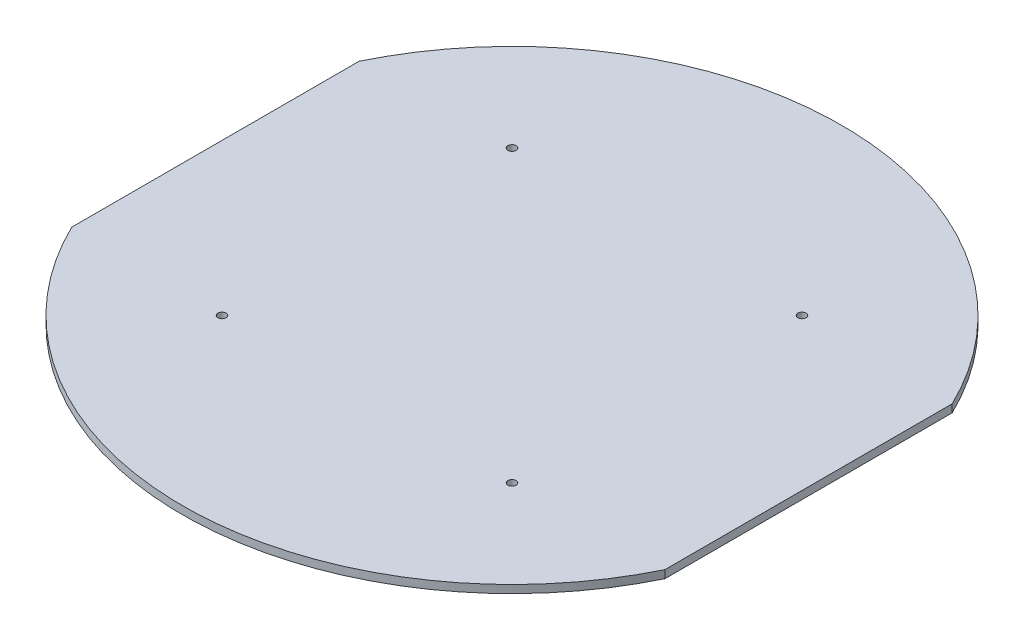
ISO-10303-21;
HEADER;
FILE_DESCRIPTION(('STEP AP214'),'2;1');
FILE_NAME('part.step','',(''),(''),'','','');
FILE_SCHEMA(('AUTOMOTIVE_DESIGN { 1 0 10303 214 1 1 1 1 }'));
ENDSEC;
DATA;
#1=APPLICATION_CONTEXT('core data for automotive mechanical design processes');
#2=APPLICATION_PROTOCOL_DEFINITION('international standard','automotive_design',2000,#1);
#3=PRODUCT_CONTEXT('',#1,'mechanical');
#4=PRODUCT('Part','Part','',(#3));
#5=PRODUCT_RELATED_PRODUCT_CATEGORY('part','',(#4));
#6=PRODUCT_DEFINITION_FORMATION('','',#4);
#7=PRODUCT_DEFINITION_CONTEXT('part definition',#1,'design');
#8=PRODUCT_DEFINITION('design','',#6,#7);
#9=PRODUCT_DEFINITION_SHAPE('','',#8);
#10=(LENGTH_UNIT() NAMED_UNIT(*) SI_UNIT(.MILLI.,.METRE.));
#11=(NAMED_UNIT(*) PLANE_ANGLE_UNIT() SI_UNIT($,.RADIAN.));
#12=(NAMED_UNIT(*) SI_UNIT($,.STERADIAN.) SOLID_ANGLE_UNIT());
#13=UNCERTAINTY_MEASURE_WITH_UNIT(LENGTH_MEASURE(1.E-05),#10,'distance_accuracy_value','');
#14=(GEOMETRIC_REPRESENTATION_CONTEXT(3) GLOBAL_UNCERTAINTY_ASSIGNED_CONTEXT((#13)) GLOBAL_UNIT_ASSIGNED_CONTEXT((#10,
#11,#12)) REPRESENTATION_CONTEXT('',''));
#15=CARTESIAN_POINT('',(0.,0.,0.));
#16=DIRECTION('',(0.,0.,1.));
#17=DIRECTION('',(1.,0.,0.));
#18=AXIS2_PLACEMENT_3D('',#15,#16,#17);
#19=CARTESIAN_POINT('',(112.5,3.,0.));
#20=DIRECTION('',(1.,0.,0.));
#21=DIRECTION('',(0.,0.,-1.));
#22=AXIS2_PLACEMENT_3D('',#19,#20,#21);
#23=PLANE('',#22);
#24=DIRECTION('',(0.,0.,1.));
#25=VECTOR('',#24,1.);
#26=CARTESIAN_POINT('',(112.5,0.,0.));
#27=LINE('',#26,#25);
#28=CARTESIAN_POINT('',(112.5,0.,-54.4862367942585));
#29=VERTEX_POINT('',#28);
#30=CARTESIAN_POINT('',(112.5,0.,54.4862367942585));
#31=VERTEX_POINT('',#30);
#32=EDGE_CURVE('E118',#29,#31,#27,.T.);
#33=ORIENTED_EDGE('',*,*,#32,.F.);
#34=DIRECTION('',(0.,-1.,0.));
#35=VECTOR('',#34,1.);
#36=CARTESIAN_POINT('',(112.5,3.,-54.4862367942585));
#37=LINE('',#36,#35);
#38=CARTESIAN_POINT('',(112.5,3.,-54.4862367942585));
#39=VERTEX_POINT('',#38);
#40=EDGE_CURVE('E11',#39,#29,#37,.T.);
#41=ORIENTED_EDGE('',*,*,#40,.F.);
#42=DIRECTION('',(0.,0.,1.));
#43=VECTOR('',#42,1.);
#44=CARTESIAN_POINT('',(112.5,3.,0.));
#45=LINE('',#44,#43);
#46=CARTESIAN_POINT('',(112.5,3.,54.4862367942585));
#47=VERTEX_POINT('',#46);
#48=EDGE_CURVE('E100',#39,#47,#45,.T.);
#49=ORIENTED_EDGE('',*,*,#48,.T.);
#50=DIRECTION('',(0.,-1.,0.));
#51=VECTOR('',#50,1.);
#52=CARTESIAN_POINT('',(112.5,3.,54.4862367942585));
#53=LINE('',#52,#51);
#54=EDGE_CURVE('E81',#47,#31,#53,.T.);
#55=ORIENTED_EDGE('',*,*,#54,.T.);
#56=EDGE_LOOP('',(#33,#41,#49,#55));
#57=FACE_BOUND('',#56,.T.);
#58=ADVANCED_FACE('F41',(#57),#23,.T.);
#59=CARTESIAN_POINT('',(0.,3.,0.));
#60=DIRECTION('',(0.,-1.,0.));
#61=DIRECTION('',(0.,0.,-1.));
#62=AXIS2_PLACEMENT_3D('',#59,#60,#61);
#63=CYLINDRICAL_SURFACE('',#62,125.);
#64=CARTESIAN_POINT('',(0.,0.,0.));
#65=DIRECTION('',(0.,1.,0.));
#66=DIRECTION('',(0.,0.,1.));
#67=AXIS2_PLACEMENT_3D('',#64,#65,#66);
#68=CIRCLE('',#67,125.);
#69=CARTESIAN_POINT('',(-112.5,0.,-54.4862367942585));
#70=VERTEX_POINT('',#69);
#71=EDGE_CURVE('E106',#29,#70,#68,.T.);
#72=ORIENTED_EDGE('',*,*,#71,.T.);
#73=DIRECTION('',(0.,-1.,0.));
#74=VECTOR('',#73,1.);
#75=CARTESIAN_POINT('',(-112.5,3.,-54.4862367942585));
#76=LINE('',#75,#74);
#77=CARTESIAN_POINT('',(-112.5,3.,-54.4862367942585));
#78=VERTEX_POINT('',#77);
#79=EDGE_CURVE('E51',#78,#70,#76,.T.);
#80=ORIENTED_EDGE('',*,*,#79,.F.);
#81=CARTESIAN_POINT('',(0.,3.,0.));
#82=DIRECTION('',(0.,1.,0.));
#83=DIRECTION('',(0.,0.,1.));
#84=AXIS2_PLACEMENT_3D('',#81,#82,#83);
#85=CIRCLE('',#84,125.);
#86=EDGE_CURVE('E97',#39,#78,#85,.T.);
#87=ORIENTED_EDGE('',*,*,#86,.F.);
#88=ORIENTED_EDGE('',*,*,#40,.T.);
#89=EDGE_LOOP('',(#72,#80,#87,#88));
#90=FACE_BOUND('',#89,.T.);
#91=ADVANCED_FACE('F104',(#90),#63,.T.);
#92=CARTESIAN_POINT('',(-112.5,3.,0.));
#93=DIRECTION('',(1.,0.,0.));
#94=DIRECTION('',(0.,0.,-1.));
#95=AXIS2_PLACEMENT_3D('',#92,#93,#94);
#96=PLANE('',#95);
#97=DIRECTION('',(0.,0.,1.));
#98=VECTOR('',#97,1.);
#99=CARTESIAN_POINT('',(-112.5,0.,0.));
#100=LINE('',#99,#98);
#101=CARTESIAN_POINT('',(-112.5,0.,54.4862367942585));
#102=VERTEX_POINT('',#101);
#103=EDGE_CURVE('E113',#70,#102,#100,.T.);
#104=ORIENTED_EDGE('',*,*,#103,.T.);
#105=DIRECTION('',(0.,-1.,0.));
#106=VECTOR('',#105,1.);
#107=CARTESIAN_POINT('',(-112.5,3.,54.4862367942585));
#108=LINE('',#107,#106);
#109=CARTESIAN_POINT('',(-112.5,3.,54.4862367942585));
#110=VERTEX_POINT('',#109);
#111=EDGE_CURVE('E95',#110,#102,#108,.T.);
#112=ORIENTED_EDGE('',*,*,#111,.F.);
#113=DIRECTION('',(0.,0.,1.));
#114=VECTOR('',#113,1.);
#115=CARTESIAN_POINT('',(-112.5,3.,0.));
#116=LINE('',#115,#114);
#117=EDGE_CURVE('E89',#78,#110,#116,.T.);
#118=ORIENTED_EDGE('',*,*,#117,.F.);
#119=ORIENTED_EDGE('',*,*,#79,.T.);
#120=EDGE_LOOP('',(#104,#112,#118,#119));
#121=FACE_BOUND('',#120,.T.);
#122=ADVANCED_FACE('F92',(#121),#96,.F.);
#123=CARTESIAN_POINT('',(-55.,3.,-55.));
#124=DIRECTION('',(0.,-1.,0.));
#125=DIRECTION('',(0.,0.,-1.));
#126=AXIS2_PLACEMENT_3D('',#123,#124,#125);
#127=CYLINDRICAL_SURFACE('',#126,1.55);
#128=CARTESIAN_POINT('',(-55.,3.,-55.));
#129=DIRECTION('',(0.,1.,0.));
#130=DIRECTION('',(0.,0.,1.));
#131=AXIS2_PLACEMENT_3D('',#128,#129,#130);
#132=CIRCLE('',#131,1.55);
#133=CARTESIAN_POINT('',(-55.,3.,-53.45));
#134=VERTEX_POINT('',#133);
#135=EDGE_CURVE('E139',#134,#134,#132,.T.);
#136=ORIENTED_EDGE('',*,*,#135,.T.);
#137=EDGE_LOOP('',(#136));
#138=FACE_BOUND('',#137,.T.);
#139=CARTESIAN_POINT('',(-55.,0.,-55.));
#140=DIRECTION('',(0.,1.,0.));
#141=DIRECTION('',(0.,0.,1.));
#142=AXIS2_PLACEMENT_3D('',#139,#140,#141);
#143=CIRCLE('',#142,1.55);
#144=CARTESIAN_POINT('',(-55.,0.,-53.45));
#145=VERTEX_POINT('',#144);
#146=EDGE_CURVE('E121',#145,#145,#143,.T.);
#147=ORIENTED_EDGE('',*,*,#146,.F.);
#148=EDGE_LOOP('',(#147));
#149=FACE_BOUND('',#148,.T.);
#150=ADVANCED_FACE('F168',(#138,#149),#127,.F.);
#151=CARTESIAN_POINT('',(55.,3.,-55.));
#152=DIRECTION('',(0.,-1.,0.));
#153=DIRECTION('',(0.,0.,-1.));
#154=AXIS2_PLACEMENT_3D('',#151,#152,#153);
#155=CYLINDRICAL_SURFACE('',#154,1.55);
#156=CARTESIAN_POINT('',(55.,3.,-55.));
#157=DIRECTION('',(0.,1.,0.));
#158=DIRECTION('',(0.,0.,1.));
#159=AXIS2_PLACEMENT_3D('',#156,#157,#158);
#160=CIRCLE('',#159,1.55);
#161=CARTESIAN_POINT('',(55.,3.,-53.45));
#162=VERTEX_POINT('',#161);
#163=EDGE_CURVE('E143',#162,#162,#160,.T.);
#164=ORIENTED_EDGE('',*,*,#163,.T.);
#165=EDGE_LOOP('',(#164));
#166=FACE_BOUND('',#165,.T.);
#167=CARTESIAN_POINT('',(55.,0.,-55.));
#168=DIRECTION('',(0.,1.,0.));
#169=DIRECTION('',(0.,0.,1.));
#170=AXIS2_PLACEMENT_3D('',#167,#168,#169);
#171=CIRCLE('',#170,1.55);
#172=CARTESIAN_POINT('',(55.,0.,-53.45));
#173=VERTEX_POINT('',#172);
#174=EDGE_CURVE('E125',#173,#173,#171,.T.);
#175=ORIENTED_EDGE('',*,*,#174,.F.);
#176=EDGE_LOOP('',(#175));
#177=FACE_BOUND('',#176,.T.);
#178=ADVANCED_FACE('F171',(#166,#177),#155,.F.);
#179=CARTESIAN_POINT('',(55.,3.,55.));
#180=DIRECTION('',(0.,-1.,0.));
#181=DIRECTION('',(0.,0.,-1.));
#182=AXIS2_PLACEMENT_3D('',#179,#180,#181);
#183=CYLINDRICAL_SURFACE('',#182,1.54999999999999);
#184=CARTESIAN_POINT('',(55.,3.,55.));
#185=DIRECTION('',(0.,1.,0.));
#186=DIRECTION('',(0.,0.,1.));
#187=AXIS2_PLACEMENT_3D('',#184,#185,#186);
#188=CIRCLE('',#187,1.54999999999999);
#189=CARTESIAN_POINT('',(55.,3.,56.55));
#190=VERTEX_POINT('',#189);
#191=EDGE_CURVE('E147',#190,#190,#188,.T.);
#192=ORIENTED_EDGE('',*,*,#191,.T.);
#193=EDGE_LOOP('',(#192));
#194=FACE_BOUND('',#193,.T.);
#195=CARTESIAN_POINT('',(55.,0.,55.));
#196=DIRECTION('',(0.,1.,0.));
#197=DIRECTION('',(0.,0.,1.));
#198=AXIS2_PLACEMENT_3D('',#195,#196,#197);
#199=CIRCLE('',#198,1.54999999999999);
#200=CARTESIAN_POINT('',(55.,0.,56.55));
#201=VERTEX_POINT('',#200);
#202=EDGE_CURVE('E129',#201,#201,#199,.T.);
#203=ORIENTED_EDGE('',*,*,#202,.F.);
#204=EDGE_LOOP('',(#203));
#205=FACE_BOUND('',#204,.T.);
#206=ADVANCED_FACE('F174',(#194,#205),#183,.F.);
#207=CARTESIAN_POINT('',(-55.,3.,55.));
#208=DIRECTION('',(0.,-1.,0.));
#209=DIRECTION('',(0.,0.,-1.));
#210=AXIS2_PLACEMENT_3D('',#207,#208,#209);
#211=CYLINDRICAL_SURFACE('',#210,1.54999999999999);
#212=CARTESIAN_POINT('',(-55.,3.,55.));
#213=DIRECTION('',(0.,1.,0.));
#214=DIRECTION('',(0.,0.,1.));
#215=AXIS2_PLACEMENT_3D('',#212,#213,#214);
#216=CIRCLE('',#215,1.54999999999999);
#217=CARTESIAN_POINT('',(-55.,3.,56.55));
#218=VERTEX_POINT('',#217);
#219=EDGE_CURVE('E151',#218,#218,#216,.T.);
#220=ORIENTED_EDGE('',*,*,#219,.T.);
#221=EDGE_LOOP('',(#220));
#222=FACE_BOUND('',#221,.T.);
#223=CARTESIAN_POINT('',(-55.,0.,55.));
#224=DIRECTION('',(0.,1.,0.));
#225=DIRECTION('',(0.,0.,1.));
#226=AXIS2_PLACEMENT_3D('',#223,#224,#225);
#227=CIRCLE('',#226,1.54999999999999);
#228=CARTESIAN_POINT('',(-55.,0.,56.55));
#229=VERTEX_POINT('',#228);
#230=EDGE_CURVE('E133',#229,#229,#227,.T.);
#231=ORIENTED_EDGE('',*,*,#230,.F.);
#232=EDGE_LOOP('',(#231));
#233=FACE_BOUND('',#232,.T.);
#234=ADVANCED_FACE('F43',(#222,#233),#211,.F.);
#235=EDGE_CURVE('E74',#102,#31,#68,.T.);
#236=ORIENTED_EDGE('',*,*,#235,.T.);
#237=ORIENTED_EDGE('',*,*,#54,.F.);
#238=EDGE_CURVE('E59',#110,#47,#85,.T.);
#239=ORIENTED_EDGE('',*,*,#238,.F.);
#240=ORIENTED_EDGE('',*,*,#111,.T.);
#241=EDGE_LOOP('',(#236,#237,#239,#240));
#242=FACE_BOUND('',#241,.T.);
#243=ADVANCED_FACE('F158',(#242),#63,.T.);
#244=CARTESIAN_POINT('',(0.,3.,0.));
#245=DIRECTION('',(0.,1.,0.));
#246=DIRECTION('',(0.,0.,1.));
#247=AXIS2_PLACEMENT_3D('',#244,#245,#246);
#248=PLANE('',#247);
#249=ORIENTED_EDGE('',*,*,#219,.F.);
#250=EDGE_LOOP('',(#249));
#251=FACE_BOUND('',#250,.T.);
#252=ORIENTED_EDGE('',*,*,#191,.F.);
#253=EDGE_LOOP('',(#252));
#254=FACE_BOUND('',#253,.T.);
#255=ORIENTED_EDGE('',*,*,#163,.F.);
#256=EDGE_LOOP('',(#255));
#257=FACE_BOUND('',#256,.T.);
#258=ORIENTED_EDGE('',*,*,#135,.F.);
#259=EDGE_LOOP('',(#258));
#260=FACE_BOUND('',#259,.T.);
#261=ORIENTED_EDGE('',*,*,#48,.F.);
#262=ORIENTED_EDGE('',*,*,#86,.T.);
#263=ORIENTED_EDGE('',*,*,#117,.T.);
#264=ORIENTED_EDGE('',*,*,#238,.T.);
#265=EDGE_LOOP('',(#261,#262,#263,#264));
#266=FACE_BOUND('',#265,.T.);
#267=ADVANCED_FACE('F99',(#251,#254,#257,#260,#266),#248,.T.);
#268=CARTESIAN_POINT('',(0.,0.,0.));
#269=DIRECTION('',(0.,1.,0.));
#270=DIRECTION('',(0.,0.,1.));
#271=AXIS2_PLACEMENT_3D('',#268,#269,#270);
#272=PLANE('',#271);
#273=ORIENTED_EDGE('',*,*,#230,.T.);
#274=EDGE_LOOP('',(#273));
#275=FACE_BOUND('',#274,.T.);
#276=ORIENTED_EDGE('',*,*,#202,.T.);
#277=EDGE_LOOP('',(#276));
#278=FACE_BOUND('',#277,.T.);
#279=ORIENTED_EDGE('',*,*,#174,.T.);
#280=EDGE_LOOP('',(#279));
#281=FACE_BOUND('',#280,.T.);
#282=ORIENTED_EDGE('',*,*,#146,.T.);
#283=EDGE_LOOP('',(#282));
#284=FACE_BOUND('',#283,.T.);
#285=ORIENTED_EDGE('',*,*,#32,.T.);
#286=ORIENTED_EDGE('',*,*,#235,.F.);
#287=ORIENTED_EDGE('',*,*,#103,.F.);
#288=ORIENTED_EDGE('',*,*,#71,.F.);
#289=EDGE_LOOP('',(#285,#286,#287,#288));
#290=FACE_BOUND('',#289,.T.);
#291=ADVANCED_FACE('F159',(#275,#278,#281,#284,#290),#272,.F.);
#292=CLOSED_SHELL('',(#58,#91,#122,#150,#178,#206,#234,#243,#267,#291));
#293=MANIFOLD_SOLID_BREP('B2',#292);
#294=ADVANCED_BREP_SHAPE_REPRESENTATION('',(#18,#293),#14);
#295=SHAPE_DEFINITION_REPRESENTATION(#9,#294);
ENDSEC;
END-ISO-10303-21;
